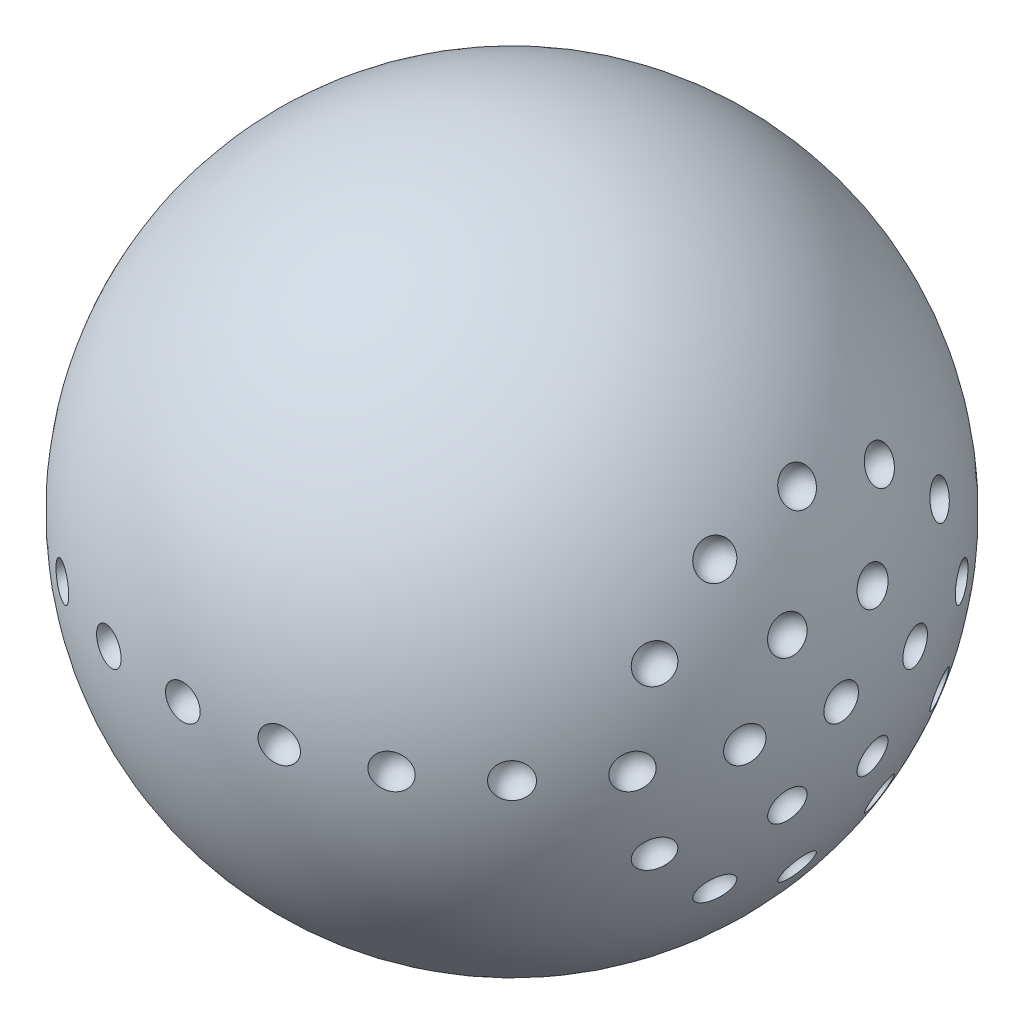
ISO-10303-21;
HEADER;
FILE_DESCRIPTION(('STEP AP214'),'2;1');
FILE_NAME('part.step','',(''),(''),'','','');
FILE_SCHEMA(('AUTOMOTIVE_DESIGN { 1 0 10303 214 1 1 1 1 }'));
ENDSEC;
DATA;
#1=APPLICATION_CONTEXT('core data for automotive mechanical design processes');
#2=APPLICATION_PROTOCOL_DEFINITION('international standard','automotive_design',2000,#1);
#3=PRODUCT_CONTEXT('',#1,'mechanical');
#4=PRODUCT('Part','Part','',(#3));
#5=PRODUCT_RELATED_PRODUCT_CATEGORY('part','',(#4));
#6=PRODUCT_DEFINITION_FORMATION('','',#4);
#7=PRODUCT_DEFINITION_CONTEXT('part definition',#1,'design');
#8=PRODUCT_DEFINITION('design','',#6,#7);
#9=PRODUCT_DEFINITION_SHAPE('','',#8);
#10=(LENGTH_UNIT() NAMED_UNIT(*) SI_UNIT(.MILLI.,.METRE.));
#11=(NAMED_UNIT(*) PLANE_ANGLE_UNIT() SI_UNIT($,.RADIAN.));
#12=(NAMED_UNIT(*) SI_UNIT($,.STERADIAN.) SOLID_ANGLE_UNIT());
#13=UNCERTAINTY_MEASURE_WITH_UNIT(LENGTH_MEASURE(1.E-05),#10,'distance_accuracy_value','');
#14=(GEOMETRIC_REPRESENTATION_CONTEXT(3) GLOBAL_UNCERTAINTY_ASSIGNED_CONTEXT((#13)) GLOBAL_UNIT_ASSIGNED_CONTEXT((#10,
#11,#12)) REPRESENTATION_CONTEXT('',''));
#15=CARTESIAN_POINT('',(0.,0.,0.));
#16=DIRECTION('',(0.,0.,1.));
#17=DIRECTION('',(1.,0.,0.));
#18=AXIS2_PLACEMENT_3D('',#15,#16,#17);
#19=CARTESIAN_POINT('',(18.3740898291126,5.30414285447599,-9.18704491455611));
#20=DIRECTION('',(0.866025403784445,0.249999999999989,-0.433012701892213));
#21=DIRECTION('',(0.,-0.866025403784445,-0.499999999999989));
#22=AXIS2_PLACEMENT_3D('',#19,#20,#21);
#23=SPHERICAL_SURFACE('',#22,1.125);
#24=CARTESIAN_POINT('',(18.4511078740342,5.32637604895997,-9.22555393701692));
#25=DIRECTION('',(0.866025403784445,0.249999999999989,-0.433012701892213));
#26=DIRECTION('',(-0.499999999999989,0.433012701892213,-0.750000000000011));
#27=AXIS2_PLACEMENT_3D('',#24,#25,#26);
#28=CIRCLE('',#27,1.12147936272075);
#29=CARTESIAN_POINT('',(17.8903681926739,5.81199085792804,-10.0666634590575));
#30=VERTEX_POINT('',#29);
#31=EDGE_CURVE('E10',#30,#30,#28,.T.);
#32=ORIENTED_EDGE('',*,*,#31,.T.);
#33=EDGE_LOOP('',(#32));
#34=FACE_BOUND('',#33,.T.);
#35=ADVANCED_FACE('F41',(#34),#23,.F.);
#36=CARTESIAN_POINT('',(18.3740898291126,9.18704491455598,-5.30414285447622));
#37=DIRECTION('',(0.866025403784445,0.433012701892207,-0.25));
#38=DIRECTION('',(0.,-0.50000000000001,-0.866025403784433));
#39=AXIS2_PLACEMENT_3D('',#36,#37,#38);
#40=SPHERICAL_SURFACE('',#39,1.125);
#41=CARTESIAN_POINT('',(18.4511078740342,9.22555393701679,-5.3263760489602));
#42=DIRECTION('',(0.866025403784445,0.433012701892207,-0.25));
#43=DIRECTION('',(-0.499999999999989,0.750000000000001,-0.433012701892231));
#44=AXIS2_PLACEMENT_3D('',#41,#42,#43);
#45=CIRCLE('',#44,1.12147936272075);
#46=CARTESIAN_POINT('',(17.8903681926739,10.0666634590573,-5.81199085792829));
#47=VERTEX_POINT('',#46);
#48=EDGE_CURVE('E48',#47,#47,#45,.T.);
#49=ORIENTED_EDGE('',*,*,#48,.T.);
#50=EDGE_LOOP('',(#49));
#51=FACE_BOUND('',#50,.T.);
#52=ADVANCED_FACE('F248',(#51),#40,.F.);
#53=CARTESIAN_POINT('',(18.3740898291126,10.6082857089522,-1.11130398088168E-13));
#54=DIRECTION('',(0.866025403784445,0.499999999999989,0.));
#55=DIRECTION('',(0.,0.,-1.));
#56=AXIS2_PLACEMENT_3D('',#53,#54,#55);
#57=SPHERICAL_SURFACE('',#56,1.125);
#58=CARTESIAN_POINT('',(18.4511078740342,10.6527520979202,-1.11596219583095E-13));
#59=DIRECTION('',(0.866025403784445,0.499999999999989,0.));
#60=DIRECTION('',(-0.499999999999989,0.866025403784445,0.));
#61=AXIS2_PLACEMENT_3D('',#58,#59,#60);
#62=CIRCLE('',#61,1.12147936272075);
#63=CARTESIAN_POINT('',(17.8903681926739,11.6239817158563,-1.21769309843362E-13));
#64=VERTEX_POINT('',#63);
#65=EDGE_CURVE('E53',#64,#64,#62,.T.);
#66=ORIENTED_EDGE('',*,*,#65,.T.);
#67=EDGE_LOOP('',(#66));
#68=FACE_BOUND('',#67,.T.);
#69=ADVANCED_FACE('F252',(#68),#57,.F.);
#70=CARTESIAN_POINT('',(18.3740898291126,9.18704491455609,5.30414285447603));
#71=DIRECTION('',(0.866025403784445,0.433012701892212,0.24999999999999));
#72=DIRECTION('',(0.,0.499999999999992,-0.866025403784443));
#73=AXIS2_PLACEMENT_3D('',#70,#71,#72);
#74=SPHERICAL_SURFACE('',#73,1.125);
#75=CARTESIAN_POINT('',(18.4511078740342,9.2255539370169,5.32637604896001));
#76=DIRECTION('',(0.866025403784445,0.433012701892212,0.24999999999999));
#77=DIRECTION('',(-0.499999999999989,0.75000000000001,0.433012701892216));
#78=AXIS2_PLACEMENT_3D('',#75,#76,#77);
#79=CIRCLE('',#78,1.12147936272075);
#80=CARTESIAN_POINT('',(17.8903681926739,10.0666634590575,5.81199085792808));
#81=VERTEX_POINT('',#80);
#82=EDGE_CURVE('E58',#81,#81,#79,.T.);
#83=ORIENTED_EDGE('',*,*,#82,.T.);
#84=EDGE_LOOP('',(#83));
#85=FACE_BOUND('',#84,.T.);
#86=ADVANCED_FACE('F256',(#85),#74,.F.);
#87=CARTESIAN_POINT('',(18.3740898291126,5.30414285447619,9.187044914556));
#88=DIRECTION('',(0.866025403784445,0.249999999999998,0.433012701892208));
#89=DIRECTION('',(0.,0.866025403784435,-0.500000000000007));
#90=AXIS2_PLACEMENT_3D('',#87,#88,#89);
#91=SPHERICAL_SURFACE('',#90,1.125);
#92=CARTESIAN_POINT('',(18.4511078740342,5.32637604896017,9.22555393701681));
#93=DIRECTION('',(0.866025403784445,0.249999999999998,0.433012701892208));
#94=DIRECTION('',(-0.499999999999989,0.433012701892229,0.750000000000002));
#95=AXIS2_PLACEMENT_3D('',#92,#93,#94);
#96=CIRCLE('',#95,1.12147936272075);
#97=CARTESIAN_POINT('',(17.8903681926739,5.81199085792825,10.0666634590574));
#98=VERTEX_POINT('',#97);
#99=EDGE_CURVE('E64',#98,#98,#96,.T.);
#100=ORIENTED_EDGE('',*,*,#99,.T.);
#101=EDGE_LOOP('',(#100));
#102=FACE_BOUND('',#101,.T.);
#103=ADVANCED_FACE('F262',(#102),#91,.F.);
#104=CARTESIAN_POINT('',(18.3740898291126,-5.30414285447606,9.18704491455607));
#105=DIRECTION('',(0.866025403784445,-0.249999999999992,0.433012701892211));
#106=DIRECTION('',(0.,0.866025403784442,0.499999999999995));
#107=AXIS2_PLACEMENT_3D('',#104,#105,#106);
#108=SPHERICAL_SURFACE('',#107,1.125);
#109=CARTESIAN_POINT('',(18.4511078740342,-5.32637604896004,9.22555393701688));
#110=DIRECTION('',(0.866025403784445,-0.249999999999992,0.433012701892211));
#111=DIRECTION('',(-0.499999999999989,-0.433012701892218,0.750000000000008));
#112=AXIS2_PLACEMENT_3D('',#109,#110,#111);
#113=CIRCLE('',#112,1.12147936272075);
#114=CARTESIAN_POINT('',(17.8903681926739,-5.81199085792811,10.0666634590575));
#115=VERTEX_POINT('',#114);
#116=EDGE_CURVE('E68',#115,#115,#113,.T.);
#117=ORIENTED_EDGE('',*,*,#116,.T.);
#118=EDGE_LOOP('',(#117));
#119=FACE_BOUND('',#118,.T.);
#120=ADVANCED_FACE('F266',(#119),#108,.F.);
#121=CARTESIAN_POINT('',(18.3740898291126,-9.18704491455602,5.30414285447615));
#122=DIRECTION('',(0.866025403784445,-0.433012701892209,0.249999999999997));
#123=DIRECTION('',(0.,0.500000000000004,0.866025403784436));
#124=AXIS2_PLACEMENT_3D('',#121,#122,#123);
#125=SPHERICAL_SURFACE('',#124,1.125);
#126=CARTESIAN_POINT('',(18.4511078740342,-9.22555393701683,5.32637604896013));
#127=DIRECTION('',(0.866025403784445,-0.433012701892209,0.249999999999997));
#128=DIRECTION('',(-0.499999999999989,-0.750000000000004,0.433012701892226));
#129=AXIS2_PLACEMENT_3D('',#126,#127,#128);
#130=CIRCLE('',#129,1.12147936272075);
#131=CARTESIAN_POINT('',(17.8903681926739,-10.0666634590574,5.81199085792822));
#132=VERTEX_POINT('',#131);
#133=EDGE_CURVE('E72',#132,#132,#130,.T.);
#134=ORIENTED_EDGE('',*,*,#133,.T.);
#135=EDGE_LOOP('',(#134));
#136=FACE_BOUND('',#135,.T.);
#137=ADVANCED_FACE('F270',(#136),#125,.F.);
#138=CARTESIAN_POINT('',(18.3740898291126,-10.6082857089522,0.));
#139=DIRECTION('',(0.866025403784445,-0.499999999999989,0.));
#140=DIRECTION('',(0.,0.,1.));
#141=AXIS2_PLACEMENT_3D('',#138,#139,#140);
#142=SPHERICAL_SURFACE('',#141,1.125);
#143=CARTESIAN_POINT('',(18.4511078740342,-10.6527520979202,0.));
#144=DIRECTION('',(0.866025403784445,-0.499999999999989,0.));
#145=DIRECTION('',(-0.499999999999989,-0.866025403784445,0.));
#146=AXIS2_PLACEMENT_3D('',#143,#144,#145);
#147=CIRCLE('',#146,1.12147936272075);
#148=CARTESIAN_POINT('',(17.8903681926739,-11.6239817158563,0.));
#149=VERTEX_POINT('',#148);
#150=EDGE_CURVE('E76',#149,#149,#147,.T.);
#151=ORIENTED_EDGE('',*,*,#150,.T.);
#152=EDGE_LOOP('',(#151));
#153=FACE_BOUND('',#152,.T.);
#154=ADVANCED_FACE('F274',(#153),#142,.F.);
#155=CARTESIAN_POINT('',(18.3740898291126,-9.18704491455605,-5.30414285447609));
#156=DIRECTION('',(0.866025403784445,-0.43301270189221,-0.249999999999993));
#157=DIRECTION('',(0.,-0.499999999999998,0.86602540378444));
#158=AXIS2_PLACEMENT_3D('',#155,#156,#157);
#159=SPHERICAL_SURFACE('',#158,1.125);
#160=CARTESIAN_POINT('',(18.4511078740342,-9.22555393701686,-5.32637604896007));
#161=DIRECTION('',(0.866025403784445,-0.43301270189221,-0.249999999999993));
#162=DIRECTION('',(-0.499999999999989,-0.750000000000007,-0.433012701892221));
#163=AXIS2_PLACEMENT_3D('',#160,#161,#162);
#164=CIRCLE('',#163,1.12147936272075);
#165=CARTESIAN_POINT('',(17.8903681926739,-10.0666634590574,-5.81199085792815));
#166=VERTEX_POINT('',#165);
#167=EDGE_CURVE('E80',#166,#166,#164,.T.);
#168=ORIENTED_EDGE('',*,*,#167,.T.);
#169=EDGE_LOOP('',(#168));
#170=FACE_BOUND('',#169,.T.);
#171=ADVANCED_FACE('F278',(#170),#159,.F.);
#172=CARTESIAN_POINT('',(18.3740898291126,-5.30414285447612,-9.18704491455603));
#173=DIRECTION('',(0.866025403784445,-0.249999999999995,-0.433012701892209));
#174=DIRECTION('',(0.,-0.866025403784438,0.500000000000001));
#175=AXIS2_PLACEMENT_3D('',#172,#173,#174);
#176=SPHERICAL_SURFACE('',#175,1.125);
#177=CARTESIAN_POINT('',(18.4511078740342,-5.3263760489601,-9.22555393701685));
#178=DIRECTION('',(0.866025403784445,-0.249999999999995,-0.433012701892209));
#179=DIRECTION('',(-0.499999999999989,-0.433012701892223,-0.750000000000005));
#180=AXIS2_PLACEMENT_3D('',#177,#178,#179);
#181=CIRCLE('',#180,1.12147936272075);
#182=CARTESIAN_POINT('',(17.8903681926739,-5.81199085792818,-10.0666634590574));
#183=VERTEX_POINT('',#182);
#184=EDGE_CURVE('E84',#183,#183,#181,.T.);
#185=ORIENTED_EDGE('',*,*,#184,.T.);
#186=EDGE_LOOP('',(#185));
#187=FACE_BOUND('',#186,.T.);
#188=ADVANCED_FACE('F282',(#187),#176,.F.);
#189=CARTESIAN_POINT('',(20.4936342778609,4.75556438419856,-2.74562637736571));
#190=DIRECTION('',(0.965925826289072,0.224143868042001,-0.129409522551257));
#191=DIRECTION('',(0.,-0.50000000000001,-0.866025403784433));
#192=AXIS2_PLACEMENT_3D('',#189,#190,#191);
#193=SPHERICAL_SURFACE('',#192,1.125);
#194=CARTESIAN_POINT('',(20.5795367448728,4.77549812104084,-2.75713512569756));
#195=DIRECTION('',(0.965925826289072,0.224143868042001,-0.129409522551257));
#196=DIRECTION('',(-0.258819045102508,0.836516303737805,-0.482962913144546));
#197=AXIS2_PLACEMENT_3D('',#194,#195,#196);
#198=CIRCLE('',#197,1.12147936272075);
#199=CARTESIAN_POINT('',(20.2892765271113,5.71363389226223,-3.29876806574866));
#200=VERTEX_POINT('',#199);
#201=EDGE_CURVE('E88',#200,#200,#198,.T.);
#202=ORIENTED_EDGE('',*,*,#201,.T.);
#203=EDGE_LOOP('',(#202));
#204=FACE_BOUND('',#203,.T.);
#205=ADVANCED_FACE('F286',(#204),#193,.F.);
#206=CARTESIAN_POINT('',(20.4936342778609,4.75556438419862,2.74562637736561));
#207=DIRECTION('',(0.965925826289072,0.224143868042003,0.129409522551252));
#208=DIRECTION('',(0.,0.499999999999992,-0.866025403784443));
#209=AXIS2_PLACEMENT_3D('',#206,#207,#208);
#210=SPHERICAL_SURFACE('',#209,1.125);
#211=CARTESIAN_POINT('',(20.5795367448728,4.7754981210409,2.75713512569746));
#212=DIRECTION('',(0.965925826289072,0.224143868042003,0.129409522551252));
#213=DIRECTION('',(-0.258819045102508,0.836516303737815,0.482962913144528));
#214=AXIS2_PLACEMENT_3D('',#211,#212,#213);
#215=CIRCLE('',#214,1.12147936272075);
#216=CARTESIAN_POINT('',(20.2892765271113,5.7136338922623,3.29876806574854));
#217=VERTEX_POINT('',#216);
#218=EDGE_CURVE('E92',#217,#217,#215,.T.);
#219=ORIENTED_EDGE('',*,*,#218,.T.);
#220=EDGE_LOOP('',(#219));
#221=FACE_BOUND('',#220,.T.);
#222=ADVANCED_FACE('F290',(#221),#210,.F.);
#223=CARTESIAN_POINT('',(20.4936342778609,-4.75556438419858,2.74562637736568));
#224=DIRECTION('',(0.965925826289072,-0.224143868042002,0.129409522551255));
#225=DIRECTION('',(0.,0.500000000000004,0.866025403784436));
#226=AXIS2_PLACEMENT_3D('',#223,#224,#225);
#227=SPHERICAL_SURFACE('',#226,1.125);
#228=CARTESIAN_POINT('',(20.5795367448728,-4.77549812104086,2.75713512569752));
#229=DIRECTION('',(0.965925826289072,-0.224143868042002,0.129409522551255));
#230=DIRECTION('',(-0.258819045102508,-0.836516303737809,0.48296291314454));
#231=AXIS2_PLACEMENT_3D('',#228,#229,#230);
#232=CIRCLE('',#231,1.12147936272075);
#233=CARTESIAN_POINT('',(20.2892765271113,-5.71363389226225,3.29876806574862));
#234=VERTEX_POINT('',#233);
#235=EDGE_CURVE('E96',#234,#234,#232,.T.);
#236=ORIENTED_EDGE('',*,*,#235,.T.);
#237=EDGE_LOOP('',(#236));
#238=FACE_BOUND('',#237,.T.);
#239=ADVANCED_FACE('F294',(#238),#227,.F.);
#240=CARTESIAN_POINT('',(20.4936342778609,-4.7555643841986,-2.74562637736565));
#241=DIRECTION('',(0.965925826289072,-0.224143868042003,-0.129409522551253));
#242=DIRECTION('',(0.,-0.499999999999998,0.86602540378444));
#243=AXIS2_PLACEMENT_3D('',#240,#241,#242);
#244=SPHERICAL_SURFACE('',#243,1.125);
#245=CARTESIAN_POINT('',(20.5795367448728,-4.77549812104088,-2.75713512569749));
#246=DIRECTION('',(0.965925826289072,-0.224143868042003,-0.129409522551253));
#247=DIRECTION('',(-0.258819045102508,-0.836516303737812,-0.482962913144534));
#248=AXIS2_PLACEMENT_3D('',#245,#246,#247);
#249=CIRCLE('',#248,1.12147936272075);
#250=CARTESIAN_POINT('',(20.2892765271113,-5.71363389226227,-3.29876806574858));
#251=VERTEX_POINT('',#250);
#252=EDGE_CURVE('E100',#251,#251,#249,.T.);
#253=ORIENTED_EDGE('',*,*,#252,.T.);
#254=EDGE_LOOP('',(#253));
#255=FACE_BOUND('',#254,.T.);
#256=ADVANCED_FACE('F194',(#255),#244,.F.);
#257=CARTESIAN_POINT('',(0.,0.,0.));
#258=DIRECTION('',(-1.,0.,0.));
#259=DIRECTION('',(0.,1.,0.));
#260=AXIS2_PLACEMENT_3D('',#257,#258,#259);
#261=SPHERICAL_SURFACE('',#260,21.335);
#262=ORIENTED_EDGE('',*,*,#31,.F.);
#263=EDGE_LOOP('',(#262));
#264=FACE_BOUND('',#263,.T.);
#265=ORIENTED_EDGE('',*,*,#48,.F.);
#266=EDGE_LOOP('',(#265));
#267=FACE_BOUND('',#266,.T.);
#268=ORIENTED_EDGE('',*,*,#65,.F.);
#269=EDGE_LOOP('',(#268));
#270=FACE_BOUND('',#269,.T.);
#271=ORIENTED_EDGE('',*,*,#82,.F.);
#272=EDGE_LOOP('',(#271));
#273=FACE_BOUND('',#272,.T.);
#274=ORIENTED_EDGE('',*,*,#99,.F.);
#275=EDGE_LOOP('',(#274));
#276=FACE_BOUND('',#275,.T.);
#277=ORIENTED_EDGE('',*,*,#116,.F.);
#278=EDGE_LOOP('',(#277));
#279=FACE_BOUND('',#278,.T.);
#280=ORIENTED_EDGE('',*,*,#133,.F.);
#281=EDGE_LOOP('',(#280));
#282=FACE_BOUND('',#281,.T.);
#283=ORIENTED_EDGE('',*,*,#150,.F.);
#284=EDGE_LOOP('',(#283));
#285=FACE_BOUND('',#284,.T.);
#286=ORIENTED_EDGE('',*,*,#167,.F.);
#287=EDGE_LOOP('',(#286));
#288=FACE_BOUND('',#287,.T.);
#289=ORIENTED_EDGE('',*,*,#184,.F.);
#290=EDGE_LOOP('',(#289));
#291=FACE_BOUND('',#290,.T.);
#292=ORIENTED_EDGE('',*,*,#201,.F.);
#293=EDGE_LOOP('',(#292));
#294=FACE_BOUND('',#293,.T.);
#295=ORIENTED_EDGE('',*,*,#218,.F.);
#296=EDGE_LOOP('',(#295));
#297=FACE_BOUND('',#296,.T.);
#298=ORIENTED_EDGE('',*,*,#235,.F.);
#299=EDGE_LOOP('',(#298));
#300=FACE_BOUND('',#299,.T.);
#301=ORIENTED_EDGE('',*,*,#252,.F.);
#302=EDGE_LOOP('',(#301));
#303=FACE_BOUND('',#302,.T.);
#304=CARTESIAN_POINT('',(21.3055041958408,0.,0.));
#305=DIRECTION('',(1.,0.,0.));
#306=DIRECTION('',(0.,1.,0.));
#307=AXIS2_PLACEMENT_3D('',#304,#305,#306);
#308=CIRCLE('',#307,1.12147936272075);
#309=CARTESIAN_POINT('',(21.3055041958408,1.12147936272075,0.));
#310=VERTEX_POINT('',#309);
#311=EDGE_CURVE('E104',#310,#310,#308,.T.);
#312=ORIENTED_EDGE('',*,*,#311,.F.);
#313=EDGE_LOOP('',(#312));
#314=FACE_BOUND('',#313,.T.);
#315=CARTESIAN_POINT('',(20.5795367448728,0.,5.51427025139529));
#316=DIRECTION('',(0.965925826289068,0.,0.258819045102521));
#317=DIRECTION('',(0.258819045102521,0.,-0.965925826289068));
#318=AXIS2_PLACEMENT_3D('',#315,#316,#317);
#319=CIRCLE('',#318,1.12147936272075);
#320=CARTESIAN_POINT('',(20.8697969626343,0.,4.43100437129311));
#321=VERTEX_POINT('',#320);
#322=EDGE_CURVE('E181',#321,#321,#319,.T.);
#323=ORIENTED_EDGE('',*,*,#322,.F.);
#324=EDGE_LOOP('',(#323));
#325=FACE_BOUND('',#324,.T.);
#326=CARTESIAN_POINT('',(18.4511078740341,0.,10.6527520979204));
#327=DIRECTION('',(0.866025403784438,0.,0.500000000000001));
#328=DIRECTION('',(0.500000000000001,0.,-0.866025403784438));
#329=AXIS2_PLACEMENT_3D('',#326,#327,#328);
#330=CIRCLE('',#329,1.12147936272075);
#331=CARTESIAN_POINT('',(19.0118475553945,0.,9.68152247998429));
#332=VERTEX_POINT('',#331);
#333=EDGE_CURVE('E177',#332,#332,#330,.T.);
#334=ORIENTED_EDGE('',*,*,#333,.F.);
#335=EDGE_LOOP('',(#334));
#336=FACE_BOUND('',#335,.T.);
#337=CARTESIAN_POINT('',(15.0652664934775,0.,15.0652664934775));
#338=DIRECTION('',(0.707106781186546,0.,0.707106781186549));
#339=DIRECTION('',(0.707106781186549,0.,-0.707106781186546));
#340=AXIS2_PLACEMENT_3D('',#337,#338,#339);
#341=CIRCLE('',#340,1.12147936272082);
#342=CARTESIAN_POINT('',(15.8582721558181,0.,14.2722608311369));
#343=VERTEX_POINT('',#342);
#344=EDGE_CURVE('E173',#343,#343,#341,.T.);
#345=ORIENTED_EDGE('',*,*,#344,.F.);
#346=EDGE_LOOP('',(#345));
#347=FACE_BOUND('',#346,.T.);
#348=CARTESIAN_POINT('',(10.6527520979204,0.,18.4511078740341));
#349=DIRECTION('',(0.499999999999998,0.,0.86602540378444));
#350=DIRECTION('',(0.86602540378444,0.,-0.499999999999998));
#351=AXIS2_PLACEMENT_3D('',#348,#349,#350);
#352=CIRCLE('',#351,1.12147936272082);
#353=CARTESIAN_POINT('',(11.6239817158566,0.,17.8903681926737));
#354=VERTEX_POINT('',#353);
#355=EDGE_CURVE('E169',#354,#354,#352,.T.);
#356=ORIENTED_EDGE('',*,*,#355,.F.);
#357=EDGE_LOOP('',(#356));
#358=FACE_BOUND('',#357,.T.);
#359=CARTESIAN_POINT('',(5.51427025139521,0.,20.5795367448728));
#360=DIRECTION('',(0.258819045102518,0.,0.965925826289069));
#361=DIRECTION('',(0.965925826289069,0.,-0.258819045102518));
#362=AXIS2_PLACEMENT_3D('',#359,#360,#361);
#363=CIRCLE('',#362,1.12147936272082);
#364=CARTESIAN_POINT('',(6.59753613149746,0.,20.2892765271112));
#365=VERTEX_POINT('',#364);
#366=EDGE_CURVE('E165',#365,#365,#363,.T.);
#367=ORIENTED_EDGE('',*,*,#366,.F.);
#368=EDGE_LOOP('',(#367));
#369=FACE_BOUND('',#368,.T.);
#370=CARTESIAN_POINT('',(0.,0.,21.3055041958408));
#371=DIRECTION('',(0.,0.,1.));
#372=DIRECTION('',(1.,0.,0.));
#373=AXIS2_PLACEMENT_3D('',#370,#371,#372);
#374=CIRCLE('',#373,1.12147936272075);
#375=CARTESIAN_POINT('',(1.12147936272067,0.,21.3055041958408));
#376=VERTEX_POINT('',#375);
#377=EDGE_CURVE('E161',#376,#376,#374,.T.);
#378=ORIENTED_EDGE('',*,*,#377,.F.);
#379=EDGE_LOOP('',(#378));
#380=FACE_BOUND('',#379,.T.);
#381=CARTESIAN_POINT('',(-5.51427025139536,0.,20.5795367448727));
#382=DIRECTION('',(-0.258819045102525,0.,0.965925826289067));
#383=DIRECTION('',(0.965925826289067,0.,0.258819045102525));
#384=AXIS2_PLACEMENT_3D('',#381,#382,#383);
#385=CIRCLE('',#384,1.12147936272075);
#386=CARTESIAN_POINT('',(-4.43100437129319,0.,20.8697969626343));
#387=VERTEX_POINT('',#386);
#388=EDGE_CURVE('E157',#387,#387,#385,.T.);
#389=ORIENTED_EDGE('',*,*,#388,.F.);
#390=EDGE_LOOP('',(#389));
#391=FACE_BOUND('',#390,.T.);
#392=CARTESIAN_POINT('',(-10.6527520979205,0.,18.4511078740341));
#393=DIRECTION('',(-0.500000000000004,0.,0.866025403784436));
#394=DIRECTION('',(0.866025403784436,0.,0.500000000000004));
#395=AXIS2_PLACEMENT_3D('',#392,#393,#394);
#396=CIRCLE('',#395,1.12147936272082);
#397=CARTESIAN_POINT('',(-9.68152247998429,0.,19.0118475553945));
#398=VERTEX_POINT('',#397);
#399=EDGE_CURVE('E153',#398,#398,#396,.T.);
#400=ORIENTED_EDGE('',*,*,#399,.F.);
#401=EDGE_LOOP('',(#400));
#402=FACE_BOUND('',#401,.T.);
#403=CARTESIAN_POINT('',(-15.0652664934776,0.,15.0652664934774));
#404=DIRECTION('',(-0.707106781186551,0.,0.707106781186544));
#405=DIRECTION('',(0.707106781186544,0.,0.707106781186551));
#406=AXIS2_PLACEMENT_3D('',#403,#404,#405);
#407=CIRCLE('',#406,1.12147936272075);
#408=CARTESIAN_POINT('',(-14.272260831137,0.,15.858272155818));
#409=VERTEX_POINT('',#408);
#410=EDGE_CURVE('E149',#409,#409,#407,.T.);
#411=ORIENTED_EDGE('',*,*,#410,.F.);
#412=EDGE_LOOP('',(#411));
#413=FACE_BOUND('',#412,.T.);
#414=CARTESIAN_POINT('',(-20.5795367448728,0.,5.51427025139514));
#415=DIRECTION('',(-0.96592582628907,0.,0.258819045102515));
#416=DIRECTION('',(0.258819045102515,0.,0.96592582628907));
#417=AXIS2_PLACEMENT_3D('',#414,#415,#416);
#418=CIRCLE('',#417,1.12147936272075);
#419=CARTESIAN_POINT('',(-20.2892765271112,0.,6.59753613149732));
#420=VERTEX_POINT('',#419);
#421=EDGE_CURVE('E145',#420,#420,#418,.T.);
#422=ORIENTED_EDGE('',*,*,#421,.F.);
#423=EDGE_LOOP('',(#422));
#424=FACE_BOUND('',#423,.T.);
#425=CARTESIAN_POINT('',(-20.5795367448727,0.,-5.51427025139543));
#426=DIRECTION('',(-0.965925826289066,0.,-0.258819045102528));
#427=DIRECTION('',(-0.258819045102528,0.,0.965925826289066));
#428=AXIS2_PLACEMENT_3D('',#425,#426,#427);
#429=CIRCLE('',#428,1.12147936272075);
#430=CARTESIAN_POINT('',(-20.8697969626343,0.,-4.43100437129326));
#431=VERTEX_POINT('',#430);
#432=EDGE_CURVE('E141',#431,#431,#429,.T.);
#433=ORIENTED_EDGE('',*,*,#432,.F.);
#434=EDGE_LOOP('',(#433));
#435=FACE_BOUND('',#434,.T.);
#436=CARTESIAN_POINT('',(-15.0652664934774,0.,-15.0652664934776));
#437=DIRECTION('',(-0.707106781186541,0.,-0.707106781186554));
#438=DIRECTION('',(-0.707106781186554,0.,0.707106781186541));
#439=AXIS2_PLACEMENT_3D('',#436,#437,#438);
#440=CIRCLE('',#439,1.12147936272075);
#441=CARTESIAN_POINT('',(-15.858272155818,0.,-14.272260831137));
#442=VERTEX_POINT('',#441);
#443=EDGE_CURVE('E137',#442,#442,#440,.T.);
#444=ORIENTED_EDGE('',*,*,#443,.F.);
#445=EDGE_LOOP('',(#444));
#446=FACE_BOUND('',#445,.T.);
#447=CARTESIAN_POINT('',(-10.6527520979202,0.,-18.4511078740342));
#448=DIRECTION('',(-0.499999999999992,0.,-0.866025403784443));
#449=DIRECTION('',(-0.866025403784443,0.,0.499999999999992));
#450=AXIS2_PLACEMENT_3D('',#447,#448,#449);
#451=CIRCLE('',#450,1.12147936272082);
#452=CARTESIAN_POINT('',(-11.6239817158565,0.,-17.8903681926738));
#453=VERTEX_POINT('',#452);
#454=EDGE_CURVE('E133',#453,#453,#451,.T.);
#455=ORIENTED_EDGE('',*,*,#454,.F.);
#456=EDGE_LOOP('',(#455));
#457=FACE_BOUND('',#456,.T.);
#458=CARTESIAN_POINT('',(-5.51427025139507,0.,-20.5795367448728));
#459=DIRECTION('',(-0.258819045102511,0.,-0.965925826289071));
#460=DIRECTION('',(-0.965925826289071,0.,0.258819045102511));
#461=AXIS2_PLACEMENT_3D('',#458,#459,#460);
#462=CIRCLE('',#461,1.12147936272075);
#463=CARTESIAN_POINT('',(-6.59753613149725,0.,-20.2892765271113));
#464=VERTEX_POINT('',#463);
#465=EDGE_CURVE('E129',#464,#464,#462,.T.);
#466=ORIENTED_EDGE('',*,*,#465,.F.);
#467=EDGE_LOOP('',(#466));
#468=FACE_BOUND('',#467,.T.);
#469=CARTESIAN_POINT('',(2.23163310943267E-13,0.,-21.3055041958408));
#470=DIRECTION('',(0.,0.,-1.));
#471=DIRECTION('',(-1.,0.,0.));
#472=AXIS2_PLACEMENT_3D('',#469,#470,#471);
#473=CIRCLE('',#472,1.12147936272075);
#474=CARTESIAN_POINT('',(-1.12147936272052,0.,-21.3055041958408));
#475=VERTEX_POINT('',#474);
#476=EDGE_CURVE('E125',#475,#475,#473,.T.);
#477=ORIENTED_EDGE('',*,*,#476,.F.);
#478=EDGE_LOOP('',(#477));
#479=FACE_BOUND('',#478,.T.);
#480=CARTESIAN_POINT('',(5.5142702513955,0.,-20.5795367448727));
#481=DIRECTION('',(0.258819045102532,0.,-0.965925826289066));
#482=DIRECTION('',(-0.965925826289066,0.,-0.258819045102532));
#483=AXIS2_PLACEMENT_3D('',#480,#481,#482);
#484=CIRCLE('',#483,1.12147936272075);
#485=CARTESIAN_POINT('',(4.43100437129333,0.,-20.8697969626343));
#486=VERTEX_POINT('',#485);
#487=EDGE_CURVE('E121',#486,#486,#484,.T.);
#488=ORIENTED_EDGE('',*,*,#487,.F.);
#489=EDGE_LOOP('',(#488));
#490=FACE_BOUND('',#489,.T.);
#491=CARTESIAN_POINT('',(10.6527520979206,0.,-18.451107874034));
#492=DIRECTION('',(0.50000000000001,0.,-0.866025403784433));
#493=DIRECTION('',(-0.866025403784433,0.,-0.50000000000001));
#494=AXIS2_PLACEMENT_3D('',#491,#492,#493);
#495=CIRCLE('',#494,1.12147936272075);
#496=CARTESIAN_POINT('',(9.68152247998449,0.,-19.0118475553944));
#497=VERTEX_POINT('',#496);
#498=EDGE_CURVE('E117',#497,#497,#495,.T.);
#499=ORIENTED_EDGE('',*,*,#498,.F.);
#500=EDGE_LOOP('',(#499));
#501=FACE_BOUND('',#500,.T.);
#502=CARTESIAN_POINT('',(15.0652664934777,0.,-15.0652664934773));
#503=DIRECTION('',(0.707106781186556,0.,-0.707106781186539));
#504=DIRECTION('',(-0.707106781186539,0.,-0.707106781186556));
#505=AXIS2_PLACEMENT_3D('',#502,#503,#504);
#506=CIRCLE('',#505,1.12147936272075);
#507=CARTESIAN_POINT('',(14.2722608311371,0.,-15.8582721558179));
#508=VERTEX_POINT('',#507);
#509=EDGE_CURVE('E113',#508,#508,#506,.T.);
#510=ORIENTED_EDGE('',*,*,#509,.F.);
#511=EDGE_LOOP('',(#510));
#512=FACE_BOUND('',#511,.T.);
#513=CARTESIAN_POINT('',(18.4511078740342,0.,-10.6527520979202));
#514=DIRECTION('',(0.866025403784445,0.,-0.499999999999989));
#515=DIRECTION('',(-0.499999999999989,0.,-0.866025403784445));
#516=AXIS2_PLACEMENT_3D('',#513,#514,#515);
#517=CIRCLE('',#516,1.12147936272075);
#518=CARTESIAN_POINT('',(17.8903681926739,0.,-11.6239817158563));
#519=VERTEX_POINT('',#518);
#520=EDGE_CURVE('E109',#519,#519,#517,.T.);
#521=ORIENTED_EDGE('',*,*,#520,.F.);
#522=EDGE_LOOP('',(#521));
#523=FACE_BOUND('',#522,.T.);
#524=CARTESIAN_POINT('',(20.5795367448728,0.,-5.514270251395));
#525=DIRECTION('',(0.965925826289072,0.,-0.258819045102508));
#526=DIRECTION('',(-0.258819045102508,0.,-0.965925826289072));
#527=AXIS2_PLACEMENT_3D('',#524,#525,#526);
#528=CIRCLE('',#527,1.12147936272075);
#529=CARTESIAN_POINT('',(20.2892765271113,0.,-6.59753613149718));
#530=VERTEX_POINT('',#529);
#531=EDGE_CURVE('E105',#530,#530,#528,.T.);
#532=ORIENTED_EDGE('',*,*,#531,.F.);
#533=EDGE_LOOP('',(#532));
#534=FACE_BOUND('',#533,.T.);
#535=ADVANCED_FACE('F191',(#264,#267,#270,#273,#276,#279,#282,#285,#288,#291,#294,#297,#300,
#303,#314,#325,#336,#347,#358,#369,#380,#391,#402,#413,#424,#435,#446,#457,#468,#479,#490,#501,
#512,#523,#534),#261,.T.);
#536=CARTESIAN_POINT('',(21.2165714179049,0.,0.));
#537=DIRECTION('',(1.,0.,0.));
#538=DIRECTION('',(0.,-1.,0.));
#539=AXIS2_PLACEMENT_3D('',#536,#537,#538);
#540=SPHERICAL_SURFACE('',#539,1.125);
#541=ORIENTED_EDGE('',*,*,#311,.T.);
#542=EDGE_LOOP('',(#541));
#543=FACE_BOUND('',#542,.T.);
#544=ADVANCED_FACE('F189',(#543),#540,.F.);
#545=CARTESIAN_POINT('',(20.4936342778608,0.,5.4912527547316));
#546=DIRECTION('',(0.965925826289068,0.,0.258819045102521));
#547=DIRECTION('',(0.,-1.,0.));
#548=AXIS2_PLACEMENT_3D('',#545,#546,#547);
#549=SPHERICAL_SURFACE('',#548,1.125);
#550=ORIENTED_EDGE('',*,*,#322,.T.);
#551=EDGE_LOOP('',(#550));
#552=FACE_BOUND('',#551,.T.);
#553=ADVANCED_FACE('F304',(#552),#549,.F.);
#554=CARTESIAN_POINT('',(18.3740898291125,0.,10.6082857089525));
#555=DIRECTION('',(0.866025403784438,0.,0.500000000000001));
#556=DIRECTION('',(0.,-1.,0.));
#557=AXIS2_PLACEMENT_3D('',#554,#555,#556);
#558=SPHERICAL_SURFACE('',#557,1.125);
#559=ORIENTED_EDGE('',*,*,#333,.T.);
#560=EDGE_LOOP('',(#559));
#561=FACE_BOUND('',#560,.T.);
#562=ADVANCED_FACE('F307',(#561),#558,.F.);
#563=CARTESIAN_POINT('',(15.0023815231292,0.,15.0023815231293));
#564=DIRECTION('',(0.707106781186546,0.,0.707106781186549));
#565=DIRECTION('',(0.,-1.,0.));
#566=AXIS2_PLACEMENT_3D('',#563,#564,#565);
#567=SPHERICAL_SURFACE('',#566,1.125);
#568=ORIENTED_EDGE('',*,*,#344,.T.);
#569=EDGE_LOOP('',(#568));
#570=FACE_BOUND('',#569,.T.);
#571=ADVANCED_FACE('F311',(#570),#567,.F.);
#572=CARTESIAN_POINT('',(10.6082857089524,0.,18.3740898291125));
#573=DIRECTION('',(0.499999999999998,0.,0.86602540378444));
#574=DIRECTION('',(0.,-1.,0.));
#575=AXIS2_PLACEMENT_3D('',#572,#573,#574);
#576=SPHERICAL_SURFACE('',#575,1.125);
#577=ORIENTED_EDGE('',*,*,#355,.T.);
#578=EDGE_LOOP('',(#577));
#579=FACE_BOUND('',#578,.T.);
#580=ADVANCED_FACE('F315',(#579),#576,.F.);
#581=CARTESIAN_POINT('',(5.49125275473153,0.,20.4936342778609));
#582=DIRECTION('',(0.258819045102518,0.,0.965925826289069));
#583=DIRECTION('',(0.,-1.,0.));
#584=AXIS2_PLACEMENT_3D('',#581,#582,#583);
#585=SPHERICAL_SURFACE('',#584,1.125);
#586=ORIENTED_EDGE('',*,*,#366,.T.);
#587=EDGE_LOOP('',(#586));
#588=FACE_BOUND('',#587,.T.);
#589=ADVANCED_FACE('F319',(#588),#585,.F.);
#590=CARTESIAN_POINT('',(0.,0.,21.2165714179049));
#591=DIRECTION('',(0.,0.,1.));
#592=DIRECTION('',(0.,-1.,0.));
#593=AXIS2_PLACEMENT_3D('',#590,#591,#592);
#594=SPHERICAL_SURFACE('',#593,1.125);
#595=ORIENTED_EDGE('',*,*,#377,.T.);
#596=EDGE_LOOP('',(#595));
#597=FACE_BOUND('',#596,.T.);
#598=ADVANCED_FACE('F323',(#597),#594,.F.);
#599=CARTESIAN_POINT('',(-5.49125275473167,0.,20.4936342778608));
#600=DIRECTION('',(-0.258819045102525,0.,0.965925826289067));
#601=DIRECTION('',(0.,-1.,0.));
#602=AXIS2_PLACEMENT_3D('',#599,#600,#601);
#603=SPHERICAL_SURFACE('',#602,1.125);
#604=ORIENTED_EDGE('',*,*,#388,.T.);
#605=EDGE_LOOP('',(#604));
#606=FACE_BOUND('',#605,.T.);
#607=ADVANCED_FACE('F327',(#606),#603,.F.);
#608=CARTESIAN_POINT('',(-10.6082857089525,0.,18.3740898291124));
#609=DIRECTION('',(-0.500000000000004,0.,0.866025403784436));
#610=DIRECTION('',(0.,-1.,0.));
#611=AXIS2_PLACEMENT_3D('',#608,#609,#610);
#612=SPHERICAL_SURFACE('',#611,1.125);
#613=ORIENTED_EDGE('',*,*,#399,.T.);
#614=EDGE_LOOP('',(#613));
#615=FACE_BOUND('',#614,.T.);
#616=ADVANCED_FACE('F331',(#615),#612,.F.);
#617=CARTESIAN_POINT('',(-15.0023815231293,0.,15.0023815231292));
#618=DIRECTION('',(-0.707106781186551,0.,0.707106781186544));
#619=DIRECTION('',(0.,-1.,0.));
#620=AXIS2_PLACEMENT_3D('',#617,#618,#619);
#621=SPHERICAL_SURFACE('',#620,1.125);
#622=ORIENTED_EDGE('',*,*,#410,.T.);
#623=EDGE_LOOP('',(#622));
#624=FACE_BOUND('',#623,.T.);
#625=ADVANCED_FACE('F335',(#624),#621,.F.);
#626=CARTESIAN_POINT('',(-20.4936342778609,0.,5.49125275473145));
#627=DIRECTION('',(-0.96592582628907,0.,0.258819045102515));
#628=DIRECTION('',(0.,-1.,0.));
#629=AXIS2_PLACEMENT_3D('',#626,#627,#628);
#630=SPHERICAL_SURFACE('',#629,1.125);
#631=ORIENTED_EDGE('',*,*,#421,.T.);
#632=EDGE_LOOP('',(#631));
#633=FACE_BOUND('',#632,.T.);
#634=ADVANCED_FACE('F339',(#633),#630,.F.);
#635=CARTESIAN_POINT('',(-20.4936342778608,0.,-5.49125275473174));
#636=DIRECTION('',(-0.965925826289066,0.,-0.258819045102528));
#637=DIRECTION('',(0.,-1.,0.));
#638=AXIS2_PLACEMENT_3D('',#635,#636,#637);
#639=SPHERICAL_SURFACE('',#638,1.125);
#640=ORIENTED_EDGE('',*,*,#432,.T.);
#641=EDGE_LOOP('',(#640));
#642=FACE_BOUND('',#641,.T.);
#643=ADVANCED_FACE('F343',(#642),#639,.F.);
#644=CARTESIAN_POINT('',(-15.0023815231291,0.,-15.0023815231294));
#645=DIRECTION('',(-0.707106781186541,0.,-0.707106781186554));
#646=DIRECTION('',(0.,-1.,0.));
#647=AXIS2_PLACEMENT_3D('',#644,#645,#646);
#648=SPHERICAL_SURFACE('',#647,1.125);
#649=ORIENTED_EDGE('',*,*,#443,.T.);
#650=EDGE_LOOP('',(#649));
#651=FACE_BOUND('',#650,.T.);
#652=ADVANCED_FACE('F347',(#651),#648,.F.);
#653=CARTESIAN_POINT('',(-10.6082857089523,0.,-18.3740898291126));
#654=DIRECTION('',(-0.499999999999992,0.,-0.866025403784443));
#655=DIRECTION('',(0.,-1.,0.));
#656=AXIS2_PLACEMENT_3D('',#653,#654,#655);
#657=SPHERICAL_SURFACE('',#656,1.125);
#658=ORIENTED_EDGE('',*,*,#454,.T.);
#659=EDGE_LOOP('',(#658));
#660=FACE_BOUND('',#659,.T.);
#661=ADVANCED_FACE('F351',(#660),#657,.F.);
#662=CARTESIAN_POINT('',(-5.49125275473138,0.,-20.4936342778609));
#663=DIRECTION('',(-0.258819045102511,0.,-0.965925826289071));
#664=DIRECTION('',(0.,-1.,0.));
#665=AXIS2_PLACEMENT_3D('',#662,#663,#664);
#666=SPHERICAL_SURFACE('',#665,1.125);
#667=ORIENTED_EDGE('',*,*,#465,.T.);
#668=EDGE_LOOP('',(#667));
#669=FACE_BOUND('',#668,.T.);
#670=ADVANCED_FACE('F355',(#669),#666,.F.);
#671=CARTESIAN_POINT('',(2.22231789539543E-13,0.,-21.2165714179049));
#672=DIRECTION('',(0.,0.,-1.));
#673=DIRECTION('',(0.,-1.,0.));
#674=AXIS2_PLACEMENT_3D('',#671,#672,#673);
#675=SPHERICAL_SURFACE('',#674,1.125);
#676=ORIENTED_EDGE('',*,*,#476,.T.);
#677=EDGE_LOOP('',(#676));
#678=FACE_BOUND('',#677,.T.);
#679=ADVANCED_FACE('F359',(#678),#675,.F.);
#680=CARTESIAN_POINT('',(5.49125275473181,0.,-20.4936342778608));
#681=DIRECTION('',(0.258819045102531,0.,-0.965925826289065));
#682=DIRECTION('',(0.,-1.,0.));
#683=AXIS2_PLACEMENT_3D('',#680,#681,#682);
#684=SPHERICAL_SURFACE('',#683,1.125);
#685=ORIENTED_EDGE('',*,*,#487,.T.);
#686=EDGE_LOOP('',(#685));
#687=FACE_BOUND('',#686,.T.);
#688=ADVANCED_FACE('F363',(#687),#684,.F.);
#689=CARTESIAN_POINT('',(10.6082857089527,0.,-18.3740898291124));
#690=DIRECTION('',(0.50000000000001,0.,-0.866025403784433));
#691=DIRECTION('',(0.,-1.,0.));
#692=AXIS2_PLACEMENT_3D('',#689,#690,#691);
#693=SPHERICAL_SURFACE('',#692,1.125);
#694=ORIENTED_EDGE('',*,*,#498,.T.);
#695=EDGE_LOOP('',(#694));
#696=FACE_BOUND('',#695,.T.);
#697=ADVANCED_FACE('F367',(#696),#693,.F.);
#698=CARTESIAN_POINT('',(15.0023815231294,0.,-15.0023815231291));
#699=DIRECTION('',(0.707106781186556,0.,-0.707106781186539));
#700=DIRECTION('',(0.,-1.,0.));
#701=AXIS2_PLACEMENT_3D('',#698,#699,#700);
#702=SPHERICAL_SURFACE('',#701,1.125);
#703=ORIENTED_EDGE('',*,*,#509,.T.);
#704=EDGE_LOOP('',(#703));
#705=FACE_BOUND('',#704,.T.);
#706=ADVANCED_FACE('F244',(#705),#702,.F.);
#707=CARTESIAN_POINT('',(18.3740898291126,0.,-10.6082857089522));
#708=DIRECTION('',(0.866025403784445,0.,-0.499999999999989));
#709=DIRECTION('',(0.,-1.,0.));
#710=AXIS2_PLACEMENT_3D('',#707,#708,#709);
#711=SPHERICAL_SURFACE('',#710,1.125);
#712=ORIENTED_EDGE('',*,*,#520,.T.);
#713=EDGE_LOOP('',(#712));
#714=FACE_BOUND('',#713,.T.);
#715=ADVANCED_FACE('F239',(#714),#711,.F.);
#716=CARTESIAN_POINT('',(20.4936342778609,0.,-5.49125275473131));
#717=DIRECTION('',(0.965925826289072,0.,-0.258819045102508));
#718=DIRECTION('',(0.,-1.,0.));
#719=AXIS2_PLACEMENT_3D('',#716,#717,#718);
#720=SPHERICAL_SURFACE('',#719,1.125);
#721=ORIENTED_EDGE('',*,*,#531,.T.);
#722=EDGE_LOOP('',(#721));
#723=FACE_BOUND('',#722,.T.);
#724=ADVANCED_FACE('F237',(#723),#720,.F.);
#725=CLOSED_SHELL('',(#35,#52,#69,#86,#103,#120,#137,#154,#171,#188,#205,#222,#239,#256,#535,
#544,#553,#562,#571,#580,#589,#598,#607,#616,#625,#634,#643,#652,#661,#670,#679,#688,#697,#706,
#715,#724));
#726=MANIFOLD_SOLID_BREP('B2',#725);
#727=ADVANCED_BREP_SHAPE_REPRESENTATION('',(#18,#726),#14);
#728=SHAPE_DEFINITION_REPRESENTATION(#9,#727);
ENDSEC;
END-ISO-10303-21;
